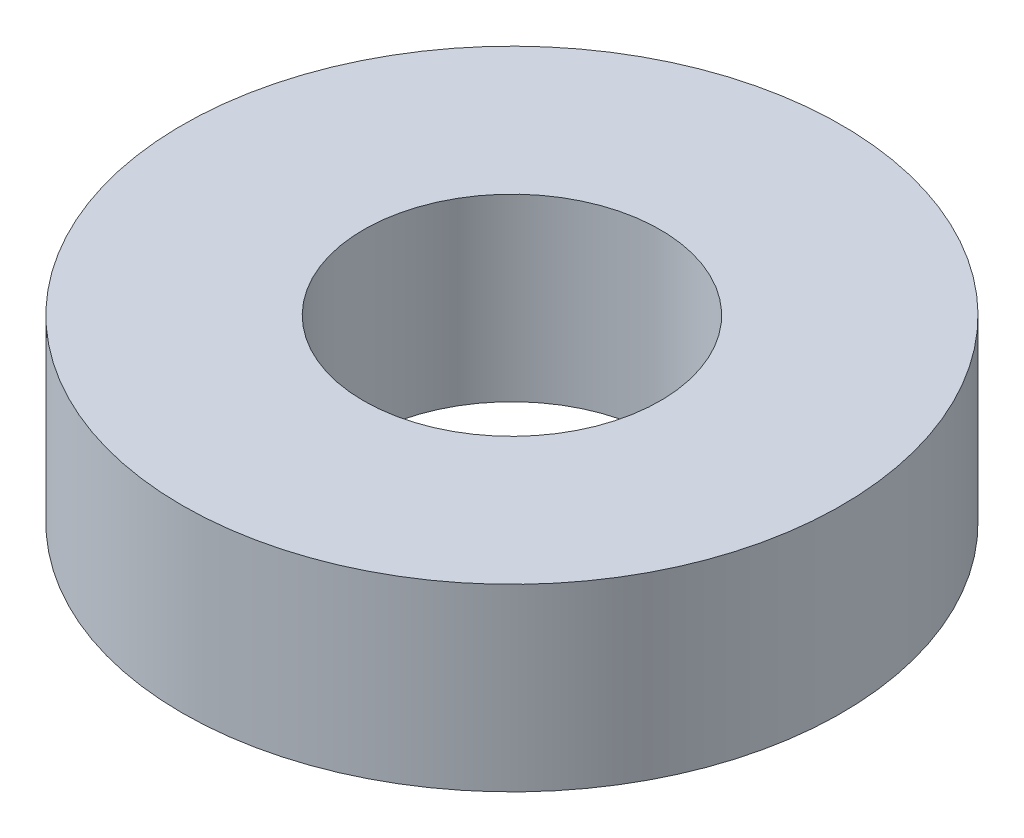
ISO-10303-21;
HEADER;
FILE_DESCRIPTION(('STEP AP214'),'2;1');
FILE_NAME('part.step','',(''),(''),'','','');
FILE_SCHEMA(('AUTOMOTIVE_DESIGN { 1 0 10303 214 1 1 1 1 }'));
ENDSEC;
DATA;
#1=APPLICATION_CONTEXT('core data for automotive mechanical design processes');
#2=APPLICATION_PROTOCOL_DEFINITION('international standard','automotive_design',2000,#1);
#3=PRODUCT_CONTEXT('',#1,'mechanical');
#4=PRODUCT('Part','Part','',(#3));
#5=PRODUCT_RELATED_PRODUCT_CATEGORY('part','',(#4));
#6=PRODUCT_DEFINITION_FORMATION('','',#4);
#7=PRODUCT_DEFINITION_CONTEXT('part definition',#1,'design');
#8=PRODUCT_DEFINITION('design','',#6,#7);
#9=PRODUCT_DEFINITION_SHAPE('','',#8);
#10=(LENGTH_UNIT() NAMED_UNIT(*) SI_UNIT(.MILLI.,.METRE.));
#11=(NAMED_UNIT(*) PLANE_ANGLE_UNIT() SI_UNIT($,.RADIAN.));
#12=(NAMED_UNIT(*) SI_UNIT($,.STERADIAN.) SOLID_ANGLE_UNIT());
#13=UNCERTAINTY_MEASURE_WITH_UNIT(LENGTH_MEASURE(1.E-05),#10,'distance_accuracy_value','');
#14=(GEOMETRIC_REPRESENTATION_CONTEXT(3) GLOBAL_UNCERTAINTY_ASSIGNED_CONTEXT((#13)) GLOBAL_UNIT_ASSIGNED_CONTEXT((#10,
#11,#12)) REPRESENTATION_CONTEXT('',''));
#15=CARTESIAN_POINT('',(0.,0.,0.));
#16=DIRECTION('',(0.,0.,1.));
#17=DIRECTION('',(1.,0.,0.));
#18=AXIS2_PLACEMENT_3D('',#15,#16,#17);
#19=CARTESIAN_POINT('',(0.,6.,0.));
#20=DIRECTION('',(0.,1.,0.));
#21=DIRECTION('',(0.,0.,1.));
#22=AXIS2_PLACEMENT_3D('',#19,#20,#21);
#23=PLANE('',#22);
#24=CARTESIAN_POINT('',(0.,6.,0.));
#25=DIRECTION('',(0.,1.,0.));
#26=DIRECTION('',(0.,0.,1.));
#27=AXIS2_PLACEMENT_3D('',#24,#25,#26);
#28=CIRCLE('',#27,11.);
#29=CARTESIAN_POINT('',(0.,6.,11.));
#30=VERTEX_POINT('',#29);
#31=EDGE_CURVE('E10',#30,#30,#28,.T.);
#32=ORIENTED_EDGE('',*,*,#31,.T.);
#33=EDGE_LOOP('',(#32));
#34=FACE_BOUND('',#33,.T.);
#35=CARTESIAN_POINT('',(0.,6.,0.));
#36=DIRECTION('',(0.,1.,0.));
#37=DIRECTION('',(0.,0.,1.));
#38=AXIS2_PLACEMENT_3D('',#35,#36,#37);
#39=CIRCLE('',#38,4.95);
#40=CARTESIAN_POINT('',(0.,6.,4.95));
#41=VERTEX_POINT('',#40);
#42=EDGE_CURVE('E45',#41,#41,#39,.T.);
#43=ORIENTED_EDGE('',*,*,#42,.F.);
#44=EDGE_LOOP('',(#43));
#45=FACE_BOUND('',#44,.T.);
#46=ADVANCED_FACE('F34',(#34,#45),#23,.T.);
#47=CARTESIAN_POINT('',(0.,0.,0.));
#48=DIRECTION('',(0.,1.,0.));
#49=DIRECTION('',(0.,0.,1.));
#50=AXIS2_PLACEMENT_3D('',#47,#48,#49);
#51=PLANE('',#50);
#52=CARTESIAN_POINT('',(0.,0.,0.));
#53=DIRECTION('',(0.,1.,0.));
#54=DIRECTION('',(0.,0.,1.));
#55=AXIS2_PLACEMENT_3D('',#52,#53,#54);
#56=CIRCLE('',#55,11.);
#57=CARTESIAN_POINT('',(0.,0.,11.));
#58=VERTEX_POINT('',#57);
#59=EDGE_CURVE('E38',#58,#58,#56,.T.);
#60=ORIENTED_EDGE('',*,*,#59,.F.);
#61=EDGE_LOOP('',(#60));
#62=FACE_BOUND('',#61,.T.);
#63=CARTESIAN_POINT('',(0.,0.,0.));
#64=DIRECTION('',(0.,1.,0.));
#65=DIRECTION('',(0.,0.,1.));
#66=AXIS2_PLACEMENT_3D('',#63,#64,#65);
#67=CIRCLE('',#66,4.95);
#68=CARTESIAN_POINT('',(0.,0.,4.95));
#69=VERTEX_POINT('',#68);
#70=EDGE_CURVE('E47',#69,#69,#67,.T.);
#71=ORIENTED_EDGE('',*,*,#70,.T.);
#72=EDGE_LOOP('',(#71));
#73=FACE_BOUND('',#72,.T.);
#74=ADVANCED_FACE('F57',(#62,#73),#51,.F.);
#75=CARTESIAN_POINT('',(0.,6.,0.));
#76=DIRECTION('',(0.,-1.,0.));
#77=DIRECTION('',(0.,0.,-1.));
#78=AXIS2_PLACEMENT_3D('',#75,#76,#77);
#79=CYLINDRICAL_SURFACE('',#78,11.);
#80=ORIENTED_EDGE('',*,*,#31,.F.);
#81=EDGE_LOOP('',(#80));
#82=FACE_BOUND('',#81,.T.);
#83=ORIENTED_EDGE('',*,*,#59,.T.);
#84=EDGE_LOOP('',(#83));
#85=FACE_BOUND('',#84,.T.);
#86=ADVANCED_FACE('F36',(#82,#85),#79,.T.);
#87=CARTESIAN_POINT('',(0.,6.,0.));
#88=DIRECTION('',(0.,-1.,0.));
#89=DIRECTION('',(0.,0.,-1.));
#90=AXIS2_PLACEMENT_3D('',#87,#88,#89);
#91=CYLINDRICAL_SURFACE('',#90,4.95);
#92=ORIENTED_EDGE('',*,*,#42,.T.);
#93=EDGE_LOOP('',(#92));
#94=FACE_BOUND('',#93,.T.);
#95=ORIENTED_EDGE('',*,*,#70,.F.);
#96=EDGE_LOOP('',(#95));
#97=FACE_BOUND('',#96,.T.);
#98=ADVANCED_FACE('F53',(#94,#97),#91,.F.);
#99=CLOSED_SHELL('',(#46,#74,#86,#98));
#100=MANIFOLD_SOLID_BREP('B2',#99);
#101=ADVANCED_BREP_SHAPE_REPRESENTATION('',(#18,#100),#14);
#102=SHAPE_DEFINITION_REPRESENTATION(#9,#101);
ENDSEC;
END-ISO-10303-21;
